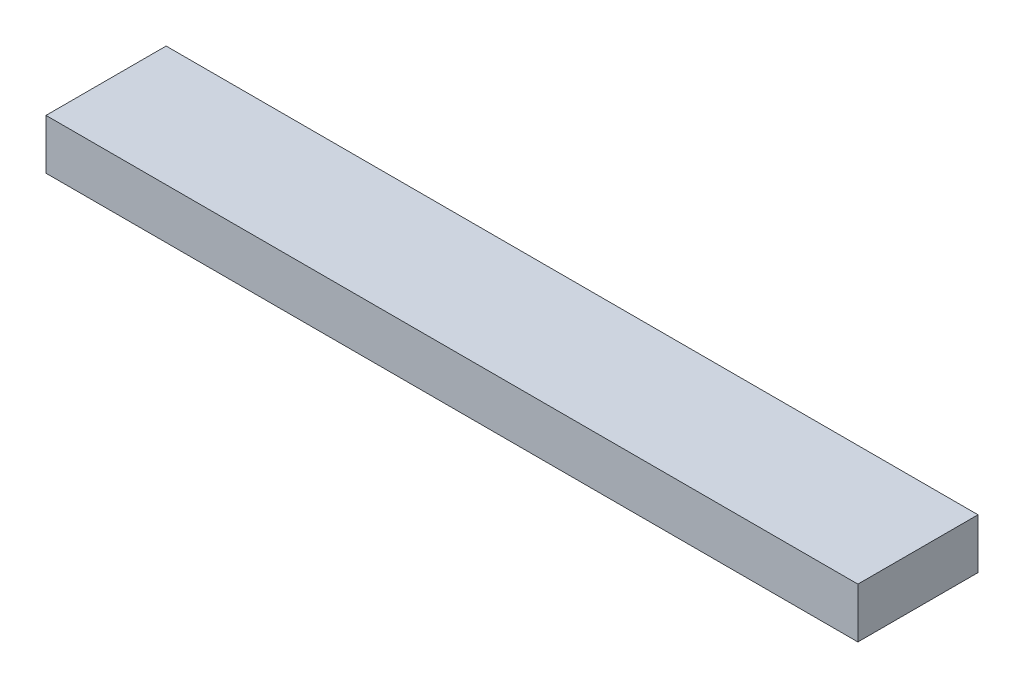
ISO-10303-21;
HEADER;
FILE_DESCRIPTION(('STEP AP214'),'2;1');
FILE_NAME('part.step','',(''),(''),'','','');
FILE_SCHEMA(('AUTOMOTIVE_DESIGN { 1 0 10303 214 1 1 1 1 }'));
ENDSEC;
DATA;
#1=APPLICATION_CONTEXT('core data for automotive mechanical design processes');
#2=APPLICATION_PROTOCOL_DEFINITION('international standard','automotive_design',2000,#1);
#3=PRODUCT_CONTEXT('',#1,'mechanical');
#4=PRODUCT('Part','Part','',(#3));
#5=PRODUCT_RELATED_PRODUCT_CATEGORY('part','',(#4));
#6=PRODUCT_DEFINITION_FORMATION('','',#4);
#7=PRODUCT_DEFINITION_CONTEXT('part definition',#1,'design');
#8=PRODUCT_DEFINITION('design','',#6,#7);
#9=PRODUCT_DEFINITION_SHAPE('','',#8);
#10=(LENGTH_UNIT() NAMED_UNIT(*) SI_UNIT(.MILLI.,.METRE.));
#11=(NAMED_UNIT(*) PLANE_ANGLE_UNIT() SI_UNIT($,.RADIAN.));
#12=(NAMED_UNIT(*) SI_UNIT($,.STERADIAN.) SOLID_ANGLE_UNIT());
#13=UNCERTAINTY_MEASURE_WITH_UNIT(LENGTH_MEASURE(1.E-05),#10,'distance_accuracy_value','');
#14=(GEOMETRIC_REPRESENTATION_CONTEXT(3) GLOBAL_UNCERTAINTY_ASSIGNED_CONTEXT((#13)) GLOBAL_UNIT_ASSIGNED_CONTEXT((#10,
#11,#12)) REPRESENTATION_CONTEXT('',''));
#15=CARTESIAN_POINT('',(0.,0.,0.));
#16=DIRECTION('',(0.,0.,1.));
#17=DIRECTION('',(1.,0.,0.));
#18=AXIS2_PLACEMENT_3D('',#15,#16,#17);
#19=CARTESIAN_POINT('',(81.,10.,11.984693877551));
#20=DIRECTION('',(-1.,0.,0.));
#21=DIRECTION('',(0.,0.,1.));
#22=AXIS2_PLACEMENT_3D('',#19,#20,#21);
#23=PLANE('',#22);
#24=DIRECTION('',(0.,0.,-1.));
#25=VECTOR('',#24,1.);
#26=CARTESIAN_POINT('',(81.,0.,11.984693877551));
#27=LINE('',#26,#25);
#28=CARTESIAN_POINT('',(81.,0.,11.984693877551));
#29=VERTEX_POINT('',#28);
#30=CARTESIAN_POINT('',(81.,0.,-11.984693877551));
#31=VERTEX_POINT('',#30);
#32=EDGE_CURVE('E113',#29,#31,#27,.T.);
#33=ORIENTED_EDGE('',*,*,#32,.T.);
#34=DIRECTION('',(0.,-1.,0.));
#35=VECTOR('',#34,1.);
#36=CARTESIAN_POINT('',(81.,10.,-11.984693877551));
#37=LINE('',#36,#35);
#38=CARTESIAN_POINT('',(81.,10.,-11.984693877551));
#39=VERTEX_POINT('',#38);
#40=EDGE_CURVE('E11',#39,#31,#37,.T.);
#41=ORIENTED_EDGE('',*,*,#40,.F.);
#42=DIRECTION('',(0.,0.,-1.));
#43=VECTOR('',#42,1.);
#44=CARTESIAN_POINT('',(81.,10.,11.984693877551));
#45=LINE('',#44,#43);
#46=CARTESIAN_POINT('',(81.,10.,11.984693877551));
#47=VERTEX_POINT('',#46);
#48=EDGE_CURVE('E97',#47,#39,#45,.T.);
#49=ORIENTED_EDGE('',*,*,#48,.F.);
#50=DIRECTION('',(0.,-1.,0.));
#51=VECTOR('',#50,1.);
#52=CARTESIAN_POINT('',(81.,10.,11.984693877551));
#53=LINE('',#52,#51);
#54=EDGE_CURVE('E109',#47,#29,#53,.T.);
#55=ORIENTED_EDGE('',*,*,#54,.T.);
#56=EDGE_LOOP('',(#33,#41,#49,#55));
#57=FACE_BOUND('',#56,.T.);
#58=ADVANCED_FACE('F45',(#57),#23,.F.);
#59=CARTESIAN_POINT('',(-81.,10.,-11.984693877551));
#60=DIRECTION('',(0.,0.,1.));
#61=DIRECTION('',(1.,0.,0.));
#62=AXIS2_PLACEMENT_3D('',#59,#60,#61);
#63=PLANE('',#62);
#64=DIRECTION('',(-1.,0.,0.));
#65=VECTOR('',#64,1.);
#66=CARTESIAN_POINT('',(-81.,0.,-11.984693877551));
#67=LINE('',#66,#65);
#68=CARTESIAN_POINT('',(-81.,0.,-11.984693877551));
#69=VERTEX_POINT('',#68);
#70=EDGE_CURVE('E102',#31,#69,#67,.T.);
#71=ORIENTED_EDGE('',*,*,#70,.T.);
#72=DIRECTION('',(0.,-1.,0.));
#73=VECTOR('',#72,1.);
#74=CARTESIAN_POINT('',(-81.,10.,-11.984693877551));
#75=LINE('',#74,#73);
#76=CARTESIAN_POINT('',(-81.,10.,-11.984693877551));
#77=VERTEX_POINT('',#76);
#78=EDGE_CURVE('E54',#77,#69,#75,.T.);
#79=ORIENTED_EDGE('',*,*,#78,.F.);
#80=DIRECTION('',(-1.,0.,0.));
#81=VECTOR('',#80,1.);
#82=CARTESIAN_POINT('',(-81.,10.,-11.984693877551));
#83=LINE('',#82,#81);
#84=EDGE_CURVE('E92',#39,#77,#83,.T.);
#85=ORIENTED_EDGE('',*,*,#84,.F.);
#86=ORIENTED_EDGE('',*,*,#40,.T.);
#87=EDGE_LOOP('',(#71,#79,#85,#86));
#88=FACE_BOUND('',#87,.T.);
#89=ADVANCED_FACE('F101',(#88),#63,.F.);
#90=CARTESIAN_POINT('',(-81.,10.,11.984693877551));
#91=DIRECTION('',(1.,0.,0.));
#92=DIRECTION('',(0.,0.,-1.));
#93=AXIS2_PLACEMENT_3D('',#90,#91,#92);
#94=PLANE('',#93);
#95=DIRECTION('',(0.,0.,1.));
#96=VECTOR('',#95,1.);
#97=CARTESIAN_POINT('',(-81.,0.,11.984693877551));
#98=LINE('',#97,#96);
#99=CARTESIAN_POINT('',(-81.,0.,11.984693877551));
#100=VERTEX_POINT('',#99);
#101=EDGE_CURVE('E79',#69,#100,#98,.T.);
#102=ORIENTED_EDGE('',*,*,#101,.T.);
#103=DIRECTION('',(0.,-1.,0.));
#104=VECTOR('',#103,1.);
#105=CARTESIAN_POINT('',(-81.,10.,11.984693877551));
#106=LINE('',#105,#104);
#107=CARTESIAN_POINT('',(-81.,10.,11.984693877551));
#108=VERTEX_POINT('',#107);
#109=EDGE_CURVE('E104',#108,#100,#106,.T.);
#110=ORIENTED_EDGE('',*,*,#109,.F.);
#111=DIRECTION('',(0.,0.,1.));
#112=VECTOR('',#111,1.);
#113=CARTESIAN_POINT('',(-81.,10.,11.984693877551));
#114=LINE('',#113,#112);
#115=EDGE_CURVE('E95',#77,#108,#114,.T.);
#116=ORIENTED_EDGE('',*,*,#115,.F.);
#117=ORIENTED_EDGE('',*,*,#78,.T.);
#118=EDGE_LOOP('',(#102,#110,#116,#117));
#119=FACE_BOUND('',#118,.T.);
#120=ADVANCED_FACE('F105',(#119),#94,.F.);
#121=CARTESIAN_POINT('',(-81.,10.,11.984693877551));
#122=DIRECTION('',(0.,0.,-1.));
#123=DIRECTION('',(-1.,0.,0.));
#124=AXIS2_PLACEMENT_3D('',#121,#122,#123);
#125=PLANE('',#124);
#126=DIRECTION('',(1.,0.,0.));
#127=VECTOR('',#126,1.);
#128=CARTESIAN_POINT('',(-81.,0.,11.984693877551));
#129=LINE('',#128,#127);
#130=EDGE_CURVE('E85',#100,#29,#129,.T.);
#131=ORIENTED_EDGE('',*,*,#130,.T.);
#132=ORIENTED_EDGE('',*,*,#54,.F.);
#133=DIRECTION('',(1.,0.,0.));
#134=VECTOR('',#133,1.);
#135=CARTESIAN_POINT('',(-81.,10.,11.984693877551));
#136=LINE('',#135,#134);
#137=EDGE_CURVE('E62',#108,#47,#136,.T.);
#138=ORIENTED_EDGE('',*,*,#137,.F.);
#139=ORIENTED_EDGE('',*,*,#109,.T.);
#140=EDGE_LOOP('',(#131,#132,#138,#139));
#141=FACE_BOUND('',#140,.T.);
#142=ADVANCED_FACE('F126',(#141),#125,.F.);
#143=CARTESIAN_POINT('',(0.,10.,0.));
#144=DIRECTION('',(0.,-1.,0.));
#145=DIRECTION('',(0.,0.,-1.));
#146=AXIS2_PLACEMENT_3D('',#143,#144,#145);
#147=PLANE('',#146);
#148=ORIENTED_EDGE('',*,*,#48,.T.);
#149=ORIENTED_EDGE('',*,*,#84,.T.);
#150=ORIENTED_EDGE('',*,*,#115,.T.);
#151=ORIENTED_EDGE('',*,*,#137,.T.);
#152=EDGE_LOOP('',(#148,#149,#150,#151));
#153=FACE_BOUND('',#152,.T.);
#154=ADVANCED_FACE('F93',(#153),#147,.F.);
#155=CARTESIAN_POINT('',(0.,0.,0.));
#156=DIRECTION('',(0.,-1.,0.));
#157=DIRECTION('',(0.,0.,-1.));
#158=AXIS2_PLACEMENT_3D('',#155,#156,#157);
#159=PLANE('',#158);
#160=ORIENTED_EDGE('',*,*,#32,.F.);
#161=ORIENTED_EDGE('',*,*,#130,.F.);
#162=ORIENTED_EDGE('',*,*,#101,.F.);
#163=ORIENTED_EDGE('',*,*,#70,.F.);
#164=EDGE_LOOP('',(#160,#161,#162,#163));
#165=FACE_BOUND('',#164,.T.);
#166=ADVANCED_FACE('F129',(#165),#159,.T.);
#167=CLOSED_SHELL('',(#58,#89,#120,#142,#154,#166));
#168=MANIFOLD_SOLID_BREP('B2',#167);
#169=ADVANCED_BREP_SHAPE_REPRESENTATION('',(#18,#168),#14);
#170=SHAPE_DEFINITION_REPRESENTATION(#9,#169);
ENDSEC;
END-ISO-10303-21;
